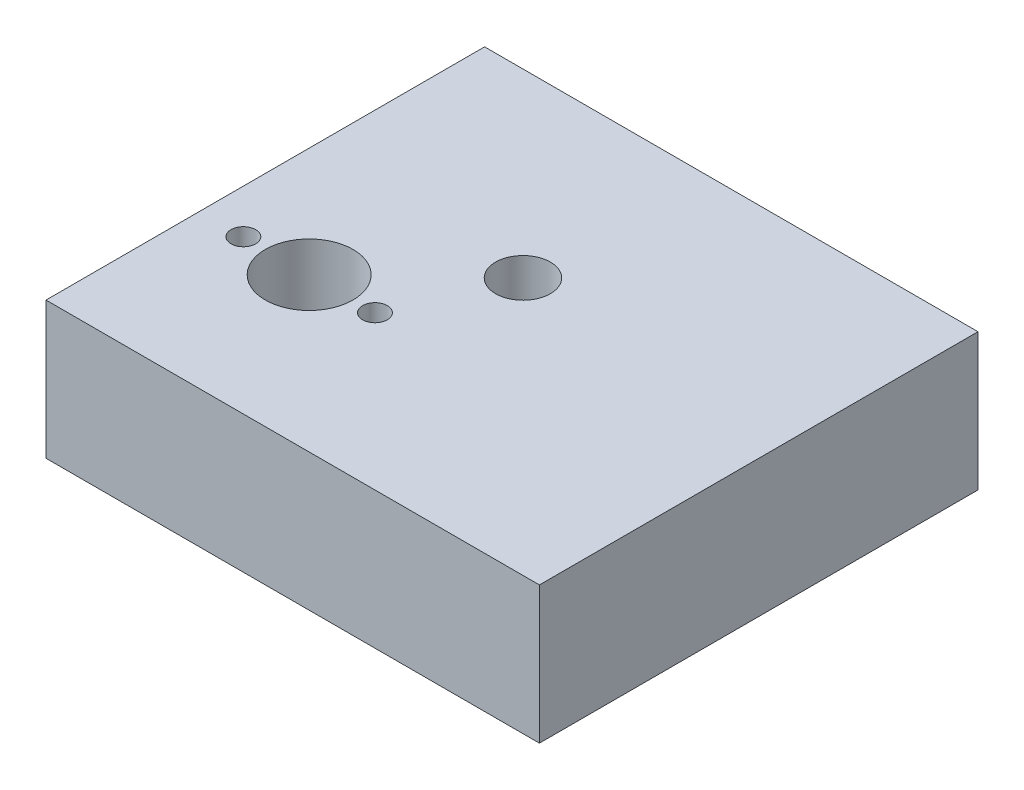
ISO-10303-21;
HEADER;
FILE_DESCRIPTION(('STEP AP214'),'2;1');
FILE_NAME('part.step','',(''),(''),'','','');
FILE_SCHEMA(('AUTOMOTIVE_DESIGN { 1 0 10303 214 1 1 1 1 }'));
ENDSEC;
DATA;
#1=APPLICATION_CONTEXT('core data for automotive mechanical design processes');
#2=APPLICATION_PROTOCOL_DEFINITION('international standard','automotive_design',2000,#1);
#3=PRODUCT_CONTEXT('',#1,'mechanical');
#4=PRODUCT('Part','Part','',(#3));
#5=PRODUCT_RELATED_PRODUCT_CATEGORY('part','',(#4));
#6=PRODUCT_DEFINITION_FORMATION('','',#4);
#7=PRODUCT_DEFINITION_CONTEXT('part definition',#1,'design');
#8=PRODUCT_DEFINITION('design','',#6,#7);
#9=PRODUCT_DEFINITION_SHAPE('','',#8);
#10=(LENGTH_UNIT() NAMED_UNIT(*) SI_UNIT(.MILLI.,.METRE.));
#11=(NAMED_UNIT(*) PLANE_ANGLE_UNIT() SI_UNIT($,.RADIAN.));
#12=(NAMED_UNIT(*) SI_UNIT($,.STERADIAN.) SOLID_ANGLE_UNIT());
#13=UNCERTAINTY_MEASURE_WITH_UNIT(LENGTH_MEASURE(1.E-05),#10,'distance_accuracy_value','');
#14=(GEOMETRIC_REPRESENTATION_CONTEXT(3) GLOBAL_UNCERTAINTY_ASSIGNED_CONTEXT((#13)) GLOBAL_UNIT_ASSIGNED_CONTEXT((#10,
#11,#12)) REPRESENTATION_CONTEXT('',''));
#15=CARTESIAN_POINT('',(0.,0.,0.));
#16=DIRECTION('',(0.,0.,1.));
#17=DIRECTION('',(1.,0.,0.));
#18=AXIS2_PLACEMENT_3D('',#15,#16,#17);
#19=CARTESIAN_POINT('',(-25.1303155006859,98.1412894375857,52.));
#20=DIRECTION('',(0.,-1.,0.));
#21=DIRECTION('',(0.,0.,-1.));
#22=AXIS2_PLACEMENT_3D('',#19,#20,#21);
#23=CYLINDRICAL_SURFACE('',#22,8.);
#24=CARTESIAN_POINT('',(-25.1303155006859,23.1412894375857,52.));
#25=DIRECTION('',(0.,-1.,0.));
#26=DIRECTION('',(0.,0.,-1.));
#27=AXIS2_PLACEMENT_3D('',#24,#25,#26);
#28=CIRCLE('',#27,8.);
#29=CARTESIAN_POINT('',(-25.1303155006859,23.1412894375857,44.));
#30=VERTEX_POINT('',#29);
#31=EDGE_CURVE('E190',#30,#30,#28,.T.);
#32=ORIENTED_EDGE('',*,*,#31,.F.);
#33=EDGE_LOOP('',(#32));
#34=FACE_BOUND('',#33,.T.);
#35=CARTESIAN_POINT('',(-25.1303155006859,8.64128943758573,52.));
#36=DIRECTION('',(0.,-1.,0.));
#37=DIRECTION('',(0.,0.,-1.));
#38=AXIS2_PLACEMENT_3D('',#35,#36,#37);
#39=CIRCLE('',#38,8.);
#40=CARTESIAN_POINT('',(-25.1303155006859,8.64128943758573,44.));
#41=VERTEX_POINT('',#40);
#42=EDGE_CURVE('E11',#41,#41,#39,.T.);
#43=ORIENTED_EDGE('',*,*,#42,.T.);
#44=EDGE_LOOP('',(#43));
#45=FACE_BOUND('',#44,.T.);
#46=ADVANCED_FACE('F38',(#34,#45),#23,.F.);
#47=CARTESIAN_POINT('',(-45.1303155006859,23.1412894375857,80.));
#48=DIRECTION('',(1.,0.,0.));
#49=DIRECTION('',(0.,0.,-1.));
#50=AXIS2_PLACEMENT_3D('',#47,#48,#49);
#51=PLANE('',#50);
#52=DIRECTION('',(0.,-1.,0.));
#53=VECTOR('',#52,1.);
#54=CARTESIAN_POINT('',(-45.1303155006859,23.1412894375857,0.));
#55=LINE('',#54,#53);
#56=CARTESIAN_POINT('',(-45.1303155006859,23.1412894375857,0.));
#57=VERTEX_POINT('',#56);
#58=CARTESIAN_POINT('',(-45.1303155006859,-1.85871056241427,0.));
#59=VERTEX_POINT('',#58);
#60=EDGE_CURVE('E124',#57,#59,#55,.T.);
#61=ORIENTED_EDGE('',*,*,#60,.T.);
#62=DIRECTION('',(0.,0.,-1.));
#63=VECTOR('',#62,1.);
#64=CARTESIAN_POINT('',(-45.1303155006859,-1.85871056241427,80.));
#65=LINE('',#64,#63);
#66=CARTESIAN_POINT('',(-45.1303155006859,-1.85871056241427,80.));
#67=VERTEX_POINT('',#66);
#68=EDGE_CURVE('E47',#67,#59,#65,.T.);
#69=ORIENTED_EDGE('',*,*,#68,.F.);
#70=DIRECTION('',(0.,-1.,0.));
#71=VECTOR('',#70,1.);
#72=CARTESIAN_POINT('',(-45.1303155006859,23.1412894375857,80.));
#73=LINE('',#72,#71);
#74=CARTESIAN_POINT('',(-45.1303155006859,23.1412894375857,80.));
#75=VERTEX_POINT('',#74);
#76=EDGE_CURVE('E130',#75,#67,#73,.T.);
#77=ORIENTED_EDGE('',*,*,#76,.F.);
#78=DIRECTION('',(0.,0.,-1.));
#79=VECTOR('',#78,1.);
#80=CARTESIAN_POINT('',(-45.1303155006859,23.1412894375857,80.));
#81=LINE('',#80,#79);
#82=EDGE_CURVE('E136',#75,#57,#81,.T.);
#83=ORIENTED_EDGE('',*,*,#82,.T.);
#84=EDGE_LOOP('',(#61,#69,#77,#83));
#85=FACE_BOUND('',#84,.T.);
#86=ADVANCED_FACE('F40',(#85),#51,.F.);
#87=CARTESIAN_POINT('',(-45.1303155006859,-1.85871056241427,80.));
#88=DIRECTION('',(0.,1.,0.));
#89=DIRECTION('',(0.,0.,1.));
#90=AXIS2_PLACEMENT_3D('',#87,#88,#89);
#91=PLANE('',#90);
#92=CARTESIAN_POINT('',(-5.13031550068586,-1.85871056241427,33.));
#93=DIRECTION('',(0.,-1.,0.));
#94=DIRECTION('',(0.,0.,-1.));
#95=AXIS2_PLACEMENT_3D('',#92,#93,#94);
#96=CIRCLE('',#95,25.);
#97=CARTESIAN_POINT('',(-28.2547202341348,-1.85871056241427,42.5006265963695));
#98=VERTEX_POINT('',#97);
#99=CARTESIAN_POINT('',(-15.8035454584327,-1.85871056241427,55.6071263602665));
#100=VERTEX_POINT('',#99);
#101=EDGE_CURVE('E117',#98,#100,#96,.T.);
#102=ORIENTED_EDGE('',*,*,#101,.F.);
#103=CARTESIAN_POINT('',(-25.1303155006859,-1.85871056241427,52.));
#104=DIRECTION('',(0.,-1.,0.));
#105=DIRECTION('',(0.,0.,-1.));
#106=AXIS2_PLACEMENT_3D('',#103,#104,#105);
#107=CIRCLE('',#106,10.);
#108=EDGE_CURVE('E104',#100,#98,#107,.T.);
#109=ORIENTED_EDGE('',*,*,#108,.F.);
#110=EDGE_LOOP('',(#102,#109));
#111=FACE_BOUND('',#110,.T.);
#112=DIRECTION('',(1.,0.,0.));
#113=VECTOR('',#112,1.);
#114=CARTESIAN_POINT('',(-45.1303155006859,-1.85871056241427,0.));
#115=LINE('',#114,#113);
#116=CARTESIAN_POINT('',(44.8696844993141,-1.85871056241427,0.));
#117=VERTEX_POINT('',#116);
#118=EDGE_CURVE('E139',#59,#117,#115,.T.);
#119=ORIENTED_EDGE('',*,*,#118,.T.);
#120=DIRECTION('',(0.,0.,-1.));
#121=VECTOR('',#120,1.);
#122=CARTESIAN_POINT('',(44.8696844993141,-1.85871056241427,80.));
#123=LINE('',#122,#121);
#124=CARTESIAN_POINT('',(44.8696844993141,-1.85871056241427,80.));
#125=VERTEX_POINT('',#124);
#126=EDGE_CURVE('E146',#125,#117,#123,.T.);
#127=ORIENTED_EDGE('',*,*,#126,.F.);
#128=DIRECTION('',(1.,0.,0.));
#129=VECTOR('',#128,1.);
#130=CARTESIAN_POINT('',(-45.1303155006859,-1.85871056241427,80.));
#131=LINE('',#130,#129);
#132=EDGE_CURVE('E87',#67,#125,#131,.T.);
#133=ORIENTED_EDGE('',*,*,#132,.F.);
#134=ORIENTED_EDGE('',*,*,#68,.T.);
#135=EDGE_LOOP('',(#119,#127,#133,#134));
#136=FACE_BOUND('',#135,.T.);
#137=ADVANCED_FACE('F116',(#111,#136),#91,.F.);
#138=CARTESIAN_POINT('',(44.8696844993141,23.1412894375857,80.));
#139=DIRECTION('',(-1.,0.,0.));
#140=DIRECTION('',(0.,0.,1.));
#141=AXIS2_PLACEMENT_3D('',#138,#139,#140);
#142=PLANE('',#141);
#143=DIRECTION('',(0.,1.,0.));
#144=VECTOR('',#143,1.);
#145=CARTESIAN_POINT('',(44.8696844993141,23.1412894375857,0.));
#146=LINE('',#145,#144);
#147=CARTESIAN_POINT('',(44.8696844993141,23.1412894375857,0.));
#148=VERTEX_POINT('',#147);
#149=EDGE_CURVE('E73',#117,#148,#146,.T.);
#150=ORIENTED_EDGE('',*,*,#149,.T.);
#151=DIRECTION('',(0.,0.,-1.));
#152=VECTOR('',#151,1.);
#153=CARTESIAN_POINT('',(44.8696844993141,23.1412894375857,80.));
#154=LINE('',#153,#152);
#155=CARTESIAN_POINT('',(44.8696844993141,23.1412894375857,80.));
#156=VERTEX_POINT('',#155);
#157=EDGE_CURVE('E144',#156,#148,#154,.T.);
#158=ORIENTED_EDGE('',*,*,#157,.F.);
#159=DIRECTION('',(0.,1.,0.));
#160=VECTOR('',#159,1.);
#161=CARTESIAN_POINT('',(44.8696844993141,23.1412894375857,80.));
#162=LINE('',#161,#160);
#163=EDGE_CURVE('E133',#125,#156,#162,.T.);
#164=ORIENTED_EDGE('',*,*,#163,.F.);
#165=ORIENTED_EDGE('',*,*,#126,.T.);
#166=EDGE_LOOP('',(#150,#158,#164,#165));
#167=FACE_BOUND('',#166,.T.);
#168=ADVANCED_FACE('F219',(#167),#142,.F.);
#169=CARTESIAN_POINT('',(-45.1303155006859,23.1412894375857,80.));
#170=DIRECTION('',(0.,-1.,0.));
#171=DIRECTION('',(0.,0.,-1.));
#172=AXIS2_PLACEMENT_3D('',#169,#170,#171);
#173=PLANE('',#172);
#174=CARTESIAN_POINT('',(-13.1303155006859,23.1412894375857,52.));
#175=DIRECTION('',(0.,1.,0.));
#176=DIRECTION('',(0.,0.,1.));
#177=AXIS2_PLACEMENT_3D('',#174,#175,#176);
#178=CIRCLE('',#177,2.25);
#179=CARTESIAN_POINT('',(-13.1303155006859,23.1412894375857,54.25));
#180=VERTEX_POINT('',#179);
#181=EDGE_CURVE('E202',#180,#180,#178,.T.);
#182=ORIENTED_EDGE('',*,*,#181,.F.);
#183=EDGE_LOOP('',(#182));
#184=FACE_BOUND('',#183,.T.);
#185=CARTESIAN_POINT('',(-37.1303155006859,23.1412894375857,52.));
#186=DIRECTION('',(0.,1.,0.));
#187=DIRECTION('',(0.,0.,1.));
#188=AXIS2_PLACEMENT_3D('',#185,#186,#187);
#189=CIRCLE('',#188,2.25);
#190=CARTESIAN_POINT('',(-37.1303155006859,23.1412894375857,54.25));
#191=VERTEX_POINT('',#190);
#192=EDGE_CURVE('E196',#191,#191,#189,.T.);
#193=ORIENTED_EDGE('',*,*,#192,.F.);
#194=EDGE_LOOP('',(#193));
#195=FACE_BOUND('',#194,.T.);
#196=ORIENTED_EDGE('',*,*,#31,.T.);
#197=EDGE_LOOP('',(#196));
#198=FACE_BOUND('',#197,.T.);
#199=CARTESIAN_POINT('',(-5.13031550068586,23.1412894375857,33.));
#200=DIRECTION('',(0.,-1.,0.));
#201=DIRECTION('',(0.,0.,-1.));
#202=AXIS2_PLACEMENT_3D('',#199,#200,#201);
#203=CIRCLE('',#202,5.);
#204=CARTESIAN_POINT('',(-5.13031550068586,23.1412894375857,28.));
#205=VERTEX_POINT('',#204);
#206=EDGE_CURVE('E122',#205,#205,#203,.T.);
#207=ORIENTED_EDGE('',*,*,#206,.T.);
#208=EDGE_LOOP('',(#207));
#209=FACE_BOUND('',#208,.T.);
#210=DIRECTION('',(-1.,0.,0.));
#211=VECTOR('',#210,1.);
#212=CARTESIAN_POINT('',(-45.1303155006859,23.1412894375857,0.));
#213=LINE('',#212,#211);
#214=EDGE_CURVE('E79',#148,#57,#213,.T.);
#215=ORIENTED_EDGE('',*,*,#214,.T.);
#216=ORIENTED_EDGE('',*,*,#82,.F.);
#217=DIRECTION('',(-1.,0.,0.));
#218=VECTOR('',#217,1.);
#219=CARTESIAN_POINT('',(-45.1303155006859,23.1412894375857,80.));
#220=LINE('',#219,#218);
#221=EDGE_CURVE('E55',#156,#75,#220,.T.);
#222=ORIENTED_EDGE('',*,*,#221,.F.);
#223=ORIENTED_EDGE('',*,*,#157,.T.);
#224=EDGE_LOOP('',(#215,#216,#222,#223));
#225=FACE_BOUND('',#224,.T.);
#226=ADVANCED_FACE('F163',(#184,#195,#198,#209,#225),#173,.F.);
#227=CARTESIAN_POINT('',(0.,0.,80.));
#228=DIRECTION('',(0.,0.,1.));
#229=DIRECTION('',(1.,0.,0.));
#230=AXIS2_PLACEMENT_3D('',#227,#228,#229);
#231=PLANE('',#230);
#232=ORIENTED_EDGE('',*,*,#76,.T.);
#233=ORIENTED_EDGE('',*,*,#132,.T.);
#234=ORIENTED_EDGE('',*,*,#163,.T.);
#235=ORIENTED_EDGE('',*,*,#221,.T.);
#236=EDGE_LOOP('',(#232,#233,#234,#235));
#237=FACE_BOUND('',#236,.T.);
#238=ADVANCED_FACE('F155',(#237),#231,.T.);
#239=CARTESIAN_POINT('',(0.,0.,0.));
#240=DIRECTION('',(0.,0.,1.));
#241=DIRECTION('',(1.,0.,0.));
#242=AXIS2_PLACEMENT_3D('',#239,#240,#241);
#243=PLANE('',#242);
#244=ORIENTED_EDGE('',*,*,#60,.F.);
#245=ORIENTED_EDGE('',*,*,#214,.F.);
#246=ORIENTED_EDGE('',*,*,#149,.F.);
#247=ORIENTED_EDGE('',*,*,#118,.F.);
#248=EDGE_LOOP('',(#244,#245,#246,#247));
#249=FACE_BOUND('',#248,.T.);
#250=ADVANCED_FACE('F153',(#249),#243,.F.);
#251=CARTESIAN_POINT('',(-5.13031550068586,8.64128943758573,33.));
#252=DIRECTION('',(0.,-1.,0.));
#253=DIRECTION('',(0.,0.,-1.));
#254=AXIS2_PLACEMENT_3D('',#251,#252,#253);
#255=CYLINDRICAL_SURFACE('',#254,25.);
#256=CARTESIAN_POINT('',(-5.13031550068586,8.64128943758573,33.));
#257=DIRECTION('',(0.,-1.,0.));
#258=DIRECTION('',(0.,0.,-1.));
#259=AXIS2_PLACEMENT_3D('',#256,#257,#258);
#260=CIRCLE('',#259,25.);
#261=CARTESIAN_POINT('',(-28.2547202341348,8.64128943758573,42.5006265963695));
#262=VERTEX_POINT('',#261);
#263=CARTESIAN_POINT('',(-15.8035454584327,8.64128943758573,55.6071263602665));
#264=VERTEX_POINT('',#263);
#265=EDGE_CURVE('E121',#262,#264,#260,.T.);
#266=ORIENTED_EDGE('',*,*,#265,.F.);
#267=DIRECTION('',(0.,-1.,0.));
#268=VECTOR('',#267,1.);
#269=CARTESIAN_POINT('',(-28.2547202341348,3.39128943758573,42.5006265963695));
#270=LINE('',#269,#268);
#271=EDGE_CURVE('E112',#262,#98,#270,.T.);
#272=ORIENTED_EDGE('',*,*,#271,.T.);
#273=ORIENTED_EDGE('',*,*,#101,.T.);
#274=DIRECTION('',(0.,-1.,0.));
#275=VECTOR('',#274,1.);
#276=CARTESIAN_POINT('',(-15.8035454584327,3.39128943758573,55.6071263602665));
#277=LINE('',#276,#275);
#278=EDGE_CURVE('E101',#100,#264,#277,.F.);
#279=ORIENTED_EDGE('',*,*,#278,.T.);
#280=EDGE_LOOP('',(#266,#272,#273,#279));
#281=FACE_BOUND('',#280,.T.);
#282=ADVANCED_FACE('F120',(#281),#255,.F.);
#283=CARTESIAN_POINT('',(-5.13031550068586,8.64128943758573,33.));
#284=DIRECTION('',(0.,-1.,0.));
#285=DIRECTION('',(0.,0.,-1.));
#286=AXIS2_PLACEMENT_3D('',#283,#284,#285);
#287=PLANE('',#286);
#288=CARTESIAN_POINT('',(-25.1303155006859,8.64128943758573,52.));
#289=DIRECTION('',(0.,-1.,0.));
#290=DIRECTION('',(0.,0.,-1.));
#291=AXIS2_PLACEMENT_3D('',#288,#289,#290);
#292=CIRCLE('',#291,10.);
#293=EDGE_CURVE('E107',#264,#262,#292,.T.);
#294=ORIENTED_EDGE('',*,*,#293,.T.);
#295=ORIENTED_EDGE('',*,*,#265,.T.);
#296=EDGE_LOOP('',(#294,#295));
#297=FACE_BOUND('',#296,.T.);
#298=ORIENTED_EDGE('',*,*,#42,.F.);
#299=EDGE_LOOP('',(#298));
#300=FACE_BOUND('',#299,.T.);
#301=CARTESIAN_POINT('',(-5.13031550068586,8.64128943758573,33.));
#302=DIRECTION('',(0.,-1.,0.));
#303=DIRECTION('',(0.,0.,-1.));
#304=AXIS2_PLACEMENT_3D('',#301,#302,#303);
#305=CIRCLE('',#304,5.);
#306=CARTESIAN_POINT('',(-5.13031550068586,8.64128943758573,28.));
#307=VERTEX_POINT('',#306);
#308=EDGE_CURVE('E127',#307,#307,#305,.T.);
#309=ORIENTED_EDGE('',*,*,#308,.F.);
#310=EDGE_LOOP('',(#309));
#311=FACE_BOUND('',#310,.T.);
#312=ADVANCED_FACE('F161',(#297,#300,#311),#287,.T.);
#313=CARTESIAN_POINT('',(-5.13031550068586,108.641289437586,33.));
#314=DIRECTION('',(0.,-1.,0.));
#315=DIRECTION('',(0.,0.,-1.));
#316=AXIS2_PLACEMENT_3D('',#313,#314,#315);
#317=CYLINDRICAL_SURFACE('',#316,5.);
#318=ORIENTED_EDGE('',*,*,#308,.T.);
#319=EDGE_LOOP('',(#318));
#320=FACE_BOUND('',#319,.T.);
#321=ORIENTED_EDGE('',*,*,#206,.F.);
#322=EDGE_LOOP('',(#321));
#323=FACE_BOUND('',#322,.T.);
#324=ADVANCED_FACE('F177',(#320,#323),#317,.F.);
#325=CARTESIAN_POINT('',(-25.1303155006859,8.64128943758573,52.));
#326=DIRECTION('',(0.,-1.,0.));
#327=DIRECTION('',(0.,0.,-1.));
#328=AXIS2_PLACEMENT_3D('',#325,#326,#327);
#329=CYLINDRICAL_SURFACE('',#328,10.);
#330=ORIENTED_EDGE('',*,*,#293,.F.);
#331=ORIENTED_EDGE('',*,*,#278,.F.);
#332=ORIENTED_EDGE('',*,*,#108,.T.);
#333=ORIENTED_EDGE('',*,*,#271,.F.);
#334=EDGE_LOOP('',(#330,#331,#332,#333));
#335=FACE_BOUND('',#334,.T.);
#336=ADVANCED_FACE('F103',(#335),#329,.F.);
#337=CARTESIAN_POINT('',(-37.1303155006859,12.6412894375857,52.));
#338=DIRECTION('',(0.,1.,0.));
#339=DIRECTION('',(0.,0.,1.));
#340=AXIS2_PLACEMENT_3D('',#337,#338,#339);
#341=CYLINDRICAL_SURFACE('',#340,2.25);
#342=CARTESIAN_POINT('',(-37.1303155006859,12.6412894375857,52.));
#343=DIRECTION('',(0.,1.,0.));
#344=DIRECTION('',(0.,0.,1.));
#345=AXIS2_PLACEMENT_3D('',#342,#343,#344);
#346=CIRCLE('',#345,2.25);
#347=CARTESIAN_POINT('',(-37.1303155006859,12.6412894375857,54.25));
#348=VERTEX_POINT('',#347);
#349=EDGE_CURVE('E118',#348,#348,#346,.T.);
#350=CARTESIAN_POINT('',(-37.1303155006859,12.6412894375857,54.25));
#351=CARTESIAN_POINT('',(-37.1303155006859,12.7506644375857,54.25));
#352=CARTESIAN_POINT('',(-37.1303155006859,12.8600394375857,54.25));
#353=CARTESIAN_POINT('',(-37.1303155006859,13.0787894375857,54.25));
#354=CARTESIAN_POINT('',(-37.1303155006859,13.1881644375857,54.25));
#355=CARTESIAN_POINT('',(-37.1303155006859,13.4069144375857,54.25));
#356=CARTESIAN_POINT('',(-37.1303155006859,13.5162894375857,54.25));
#357=CARTESIAN_POINT('',(-37.1303155006859,13.7350394375857,54.25));
#358=CARTESIAN_POINT('',(-37.1303155006859,13.8444144375857,54.25));
#359=CARTESIAN_POINT('',(-37.1303155006859,14.0631644375857,54.25));
#360=CARTESIAN_POINT('',(-37.1303155006859,14.1725394375857,54.25));
#361=CARTESIAN_POINT('',(-37.1303155006859,14.3912894375857,54.25));
#362=CARTESIAN_POINT('',(-37.1303155006859,14.5006644375857,54.25));
#363=CARTESIAN_POINT('',(-37.1303155006859,14.7194144375857,54.25));
#364=CARTESIAN_POINT('',(-37.1303155006859,14.8287894375857,54.25));
#365=CARTESIAN_POINT('',(-37.1303155006859,15.0475394375857,54.25));
#366=CARTESIAN_POINT('',(-37.1303155006859,15.1569144375857,54.25));
#367=CARTESIAN_POINT('',(-37.1303155006859,15.3756644375857,54.25));
#368=CARTESIAN_POINT('',(-37.1303155006859,15.4850394375857,54.25));
#369=CARTESIAN_POINT('',(-37.1303155006859,15.7037894375857,54.25));
#370=CARTESIAN_POINT('',(-37.1303155006859,15.8131644375857,54.25));
#371=CARTESIAN_POINT('',(-37.1303155006859,16.0319144375857,54.25));
#372=CARTESIAN_POINT('',(-37.1303155006859,16.1412894375857,54.25));
#373=CARTESIAN_POINT('',(-37.1303155006859,16.3600394375857,54.25));
#374=CARTESIAN_POINT('',(-37.1303155006859,16.4694144375857,54.25));
#375=CARTESIAN_POINT('',(-37.1303155006859,16.6881644375857,54.25));
#376=CARTESIAN_POINT('',(-37.1303155006859,16.7975394375857,54.25));
#377=CARTESIAN_POINT('',(-37.1303155006859,17.0162894375857,54.25));
#378=CARTESIAN_POINT('',(-37.1303155006859,17.1256644375857,54.25));
#379=CARTESIAN_POINT('',(-37.1303155006859,17.3444144375857,54.25));
#380=CARTESIAN_POINT('',(-37.1303155006859,17.4537894375857,54.25));
#381=CARTESIAN_POINT('',(-37.1303155006859,17.6725394375857,54.25));
#382=CARTESIAN_POINT('',(-37.1303155006859,17.7819144375857,54.25));
#383=CARTESIAN_POINT('',(-37.1303155006859,18.0006644375857,54.25));
#384=CARTESIAN_POINT('',(-37.1303155006859,18.1100394375857,54.25));
#385=CARTESIAN_POINT('',(-37.1303155006859,18.3287894375857,54.25));
#386=CARTESIAN_POINT('',(-37.1303155006859,18.4381644375857,54.25));
#387=CARTESIAN_POINT('',(-37.1303155006859,18.6569144375857,54.25));
#388=CARTESIAN_POINT('',(-37.1303155006859,18.7662894375857,54.25));
#389=CARTESIAN_POINT('',(-37.1303155006859,18.9850394375857,54.25));
#390=CARTESIAN_POINT('',(-37.1303155006859,19.0944144375857,54.25));
#391=CARTESIAN_POINT('',(-37.1303155006859,19.3131644375857,54.25));
#392=CARTESIAN_POINT('',(-37.1303155006859,19.4225394375857,54.25));
#393=CARTESIAN_POINT('',(-37.1303155006859,19.6412894375857,54.25));
#394=CARTESIAN_POINT('',(-37.1303155006859,19.7506644375857,54.25));
#395=CARTESIAN_POINT('',(-37.1303155006859,19.9694144375857,54.25));
#396=CARTESIAN_POINT('',(-37.1303155006859,20.0787894375857,54.25));
#397=CARTESIAN_POINT('',(-37.1303155006859,20.2975394375857,54.25));
#398=CARTESIAN_POINT('',(-37.1303155006859,20.4069144375857,54.25));
#399=CARTESIAN_POINT('',(-37.1303155006859,20.6256644375857,54.25));
#400=CARTESIAN_POINT('',(-37.1303155006859,20.7350394375857,54.25));
#401=CARTESIAN_POINT('',(-37.1303155006859,20.9537894375857,54.25));
#402=CARTESIAN_POINT('',(-37.1303155006859,21.0631644375857,54.25));
#403=CARTESIAN_POINT('',(-37.1303155006859,21.2819144375857,54.25));
#404=CARTESIAN_POINT('',(-37.1303155006859,21.3912894375857,54.25));
#405=CARTESIAN_POINT('',(-37.1303155006859,21.6100394375857,54.25));
#406=CARTESIAN_POINT('',(-37.1303155006859,21.7194144375857,54.25));
#407=CARTESIAN_POINT('',(-37.1303155006859,21.9381644375857,54.25));
#408=CARTESIAN_POINT('',(-37.1303155006859,22.0475394375857,54.25));
#409=CARTESIAN_POINT('',(-37.1303155006859,22.2662894375857,54.25));
#410=CARTESIAN_POINT('',(-37.1303155006859,22.3756644375857,54.25));
#411=CARTESIAN_POINT('',(-37.1303155006859,22.5944144375857,54.25));
#412=CARTESIAN_POINT('',(-37.1303155006859,22.7037894375857,54.25));
#413=CARTESIAN_POINT('',(-37.1303155006859,22.9225394375857,54.25));
#414=CARTESIAN_POINT('',(-37.1303155006859,23.0319144375857,54.25));
#415=CARTESIAN_POINT('',(-37.1303155006859,23.1412894375857,54.25));
#416=B_SPLINE_CURVE_WITH_KNOTS('',3,(#350,#351,#352,#353,#354,#355,#356,#357,#358,#359,#360,
#361,#362,#363,#364,#365,#366,#367,#368,#369,#370,#371,#372,#373,#374,#375,#376,#377,#378,#379,
#380,#381,#382,#383,#384,#385,#386,#387,#388,#389,#390,#391,#392,#393,#394,#395,#396,#397,#398,
#399,#400,#401,#402,#403,#404,#405,#406,#407,#408,#409,#410,#411,#412,#413,#414,#415),
.UNSPECIFIED.,.F.,.F.,(4,2,2,2,2,2,2,2,2,2,2,2,2,2,2,2,2,2,2,2,2,2,2,2,2,2,2,2,2,2,2,2,4),(0.,
0.328125,0.656250000000001,0.984375000000001,1.3125,1.640625,1.96875,2.296875,2.625,2.953125,
3.28125,3.609375,3.9375,4.265625,4.59375,4.921875,5.25,5.578125,5.90625,6.234375,6.5625,
6.890625,7.21875,7.54687500000001,7.875,8.203125,8.53125,8.859375,9.1875,9.515625,9.84375,
10.171875,10.5),.UNSPECIFIED.);
#417=EDGE_CURVE('BSEAM226',#348,#191,#416,.T.);
#418=ORIENTED_EDGE('',*,*,#349,.F.);
#419=ORIENTED_EDGE('',*,*,#192,.T.);
#420=ORIENTED_EDGE('',*,*,#417,.T.);
#421=ORIENTED_EDGE('',*,*,#417,.F.);
#422=EDGE_LOOP('',(#418,#420,#419,#421));
#423=FACE_BOUND('',#422,.T.);
#424=ADVANCED_FACE('F226',(#423),#341,.F.);
#425=CARTESIAN_POINT('',(-37.1303155006859,12.6412894375857,52.));
#426=DIRECTION('',(0.,1.,0.));
#427=DIRECTION('',(0.,0.,1.));
#428=AXIS2_PLACEMENT_3D('',#425,#426,#427);
#429=PLANE('',#428);
#430=ORIENTED_EDGE('',*,*,#349,.T.);
#431=EDGE_LOOP('',(#430));
#432=FACE_BOUND('',#431,.T.);
#433=ADVANCED_FACE('F213',(#432),#429,.T.);
#434=CARTESIAN_POINT('',(-13.1303155006859,12.6412894375857,52.));
#435=DIRECTION('',(0.,1.,0.));
#436=DIRECTION('',(0.,0.,1.));
#437=AXIS2_PLACEMENT_3D('',#434,#435,#436);
#438=CYLINDRICAL_SURFACE('',#437,2.25);
#439=CARTESIAN_POINT('',(-13.1303155006859,12.6412894375857,52.));
#440=DIRECTION('',(0.,1.,0.));
#441=DIRECTION('',(0.,0.,1.));
#442=AXIS2_PLACEMENT_3D('',#439,#440,#441);
#443=CIRCLE('',#442,2.25);
#444=CARTESIAN_POINT('',(-13.1303155006859,12.6412894375857,54.25));
#445=VERTEX_POINT('',#444);
#446=EDGE_CURVE('E199',#445,#445,#443,.T.);
#447=CARTESIAN_POINT('',(-13.1303155006859,12.6412894375857,54.25));
#448=CARTESIAN_POINT('',(-13.1303155006859,12.7506644375857,54.25));
#449=CARTESIAN_POINT('',(-13.1303155006859,12.8600394375857,54.25));
#450=CARTESIAN_POINT('',(-13.1303155006859,13.0787894375857,54.25));
#451=CARTESIAN_POINT('',(-13.1303155006859,13.1881644375857,54.25));
#452=CARTESIAN_POINT('',(-13.1303155006859,13.4069144375857,54.25));
#453=CARTESIAN_POINT('',(-13.1303155006859,13.5162894375857,54.25));
#454=CARTESIAN_POINT('',(-13.1303155006859,13.7350394375857,54.25));
#455=CARTESIAN_POINT('',(-13.1303155006859,13.8444144375857,54.25));
#456=CARTESIAN_POINT('',(-13.1303155006859,14.0631644375857,54.25));
#457=CARTESIAN_POINT('',(-13.1303155006859,14.1725394375857,54.25));
#458=CARTESIAN_POINT('',(-13.1303155006859,14.3912894375857,54.25));
#459=CARTESIAN_POINT('',(-13.1303155006859,14.5006644375857,54.25));
#460=CARTESIAN_POINT('',(-13.1303155006859,14.7194144375857,54.25));
#461=CARTESIAN_POINT('',(-13.1303155006859,14.8287894375857,54.25));
#462=CARTESIAN_POINT('',(-13.1303155006859,15.0475394375857,54.25));
#463=CARTESIAN_POINT('',(-13.1303155006859,15.1569144375857,54.25));
#464=CARTESIAN_POINT('',(-13.1303155006859,15.3756644375857,54.25));
#465=CARTESIAN_POINT('',(-13.1303155006859,15.4850394375857,54.25));
#466=CARTESIAN_POINT('',(-13.1303155006859,15.7037894375857,54.25));
#467=CARTESIAN_POINT('',(-13.1303155006859,15.8131644375857,54.25));
#468=CARTESIAN_POINT('',(-13.1303155006859,16.0319144375857,54.25));
#469=CARTESIAN_POINT('',(-13.1303155006859,16.1412894375857,54.25));
#470=CARTESIAN_POINT('',(-13.1303155006859,16.3600394375857,54.25));
#471=CARTESIAN_POINT('',(-13.1303155006859,16.4694144375857,54.25));
#472=CARTESIAN_POINT('',(-13.1303155006859,16.6881644375857,54.25));
#473=CARTESIAN_POINT('',(-13.1303155006859,16.7975394375857,54.25));
#474=CARTESIAN_POINT('',(-13.1303155006859,17.0162894375857,54.25));
#475=CARTESIAN_POINT('',(-13.1303155006859,17.1256644375857,54.25));
#476=CARTESIAN_POINT('',(-13.1303155006859,17.3444144375857,54.25));
#477=CARTESIAN_POINT('',(-13.1303155006859,17.4537894375857,54.25));
#478=CARTESIAN_POINT('',(-13.1303155006859,17.6725394375857,54.25));
#479=CARTESIAN_POINT('',(-13.1303155006859,17.7819144375857,54.25));
#480=CARTESIAN_POINT('',(-13.1303155006859,18.0006644375857,54.25));
#481=CARTESIAN_POINT('',(-13.1303155006859,18.1100394375857,54.25));
#482=CARTESIAN_POINT('',(-13.1303155006859,18.3287894375857,54.25));
#483=CARTESIAN_POINT('',(-13.1303155006859,18.4381644375857,54.25));
#484=CARTESIAN_POINT('',(-13.1303155006859,18.6569144375857,54.25));
#485=CARTESIAN_POINT('',(-13.1303155006859,18.7662894375857,54.25));
#486=CARTESIAN_POINT('',(-13.1303155006859,18.9850394375857,54.25));
#487=CARTESIAN_POINT('',(-13.1303155006859,19.0944144375857,54.25));
#488=CARTESIAN_POINT('',(-13.1303155006859,19.3131644375857,54.25));
#489=CARTESIAN_POINT('',(-13.1303155006859,19.4225394375857,54.25));
#490=CARTESIAN_POINT('',(-13.1303155006859,19.6412894375857,54.25));
#491=CARTESIAN_POINT('',(-13.1303155006859,19.7506644375857,54.25));
#492=CARTESIAN_POINT('',(-13.1303155006859,19.9694144375857,54.25));
#493=CARTESIAN_POINT('',(-13.1303155006859,20.0787894375857,54.25));
#494=CARTESIAN_POINT('',(-13.1303155006859,20.2975394375857,54.25));
#495=CARTESIAN_POINT('',(-13.1303155006859,20.4069144375857,54.25));
#496=CARTESIAN_POINT('',(-13.1303155006859,20.6256644375857,54.25));
#497=CARTESIAN_POINT('',(-13.1303155006859,20.7350394375857,54.25));
#498=CARTESIAN_POINT('',(-13.1303155006859,20.9537894375857,54.25));
#499=CARTESIAN_POINT('',(-13.1303155006859,21.0631644375857,54.25));
#500=CARTESIAN_POINT('',(-13.1303155006859,21.2819144375857,54.25));
#501=CARTESIAN_POINT('',(-13.1303155006859,21.3912894375857,54.25));
#502=CARTESIAN_POINT('',(-13.1303155006859,21.6100394375857,54.25));
#503=CARTESIAN_POINT('',(-13.1303155006859,21.7194144375857,54.25));
#504=CARTESIAN_POINT('',(-13.1303155006859,21.9381644375857,54.25));
#505=CARTESIAN_POINT('',(-13.1303155006859,22.0475394375857,54.25));
#506=CARTESIAN_POINT('',(-13.1303155006859,22.2662894375857,54.25));
#507=CARTESIAN_POINT('',(-13.1303155006859,22.3756644375857,54.25));
#508=CARTESIAN_POINT('',(-13.1303155006859,22.5944144375857,54.25));
#509=CARTESIAN_POINT('',(-13.1303155006859,22.7037894375857,54.25));
#510=CARTESIAN_POINT('',(-13.1303155006859,22.9225394375857,54.25));
#511=CARTESIAN_POINT('',(-13.1303155006859,23.0319144375857,54.25));
#512=CARTESIAN_POINT('',(-13.1303155006859,23.1412894375857,54.25));
#513=B_SPLINE_CURVE_WITH_KNOTS('',3,(#447,#448,#449,#450,#451,#452,#453,#454,#455,#456,#457,
#458,#459,#460,#461,#462,#463,#464,#465,#466,#467,#468,#469,#470,#471,#472,#473,#474,#475,#476,
#477,#478,#479,#480,#481,#482,#483,#484,#485,#486,#487,#488,#489,#490,#491,#492,#493,#494,#495,
#496,#497,#498,#499,#500,#501,#502,#503,#504,#505,#506,#507,#508,#509,#510,#511,#512),
.UNSPECIFIED.,.F.,.F.,(4,2,2,2,2,2,2,2,2,2,2,2,2,2,2,2,2,2,2,2,2,2,2,2,2,2,2,2,2,2,2,2,4),(0.,
0.328125,0.656250000000001,0.984375000000001,1.3125,1.640625,1.96875,2.296875,2.625,2.953125,
3.28125,3.609375,3.9375,4.265625,4.59375,4.921875,5.25,5.578125,5.90625,6.234375,6.5625,
6.890625,7.21875,7.54687500000001,7.875,8.203125,8.53125,8.859375,9.1875,9.515625,9.84375,
10.171875,10.5),.UNSPECIFIED.);
#514=EDGE_CURVE('BSEAM210',#445,#180,#513,.T.);
#515=ORIENTED_EDGE('',*,*,#446,.F.);
#516=ORIENTED_EDGE('',*,*,#181,.T.);
#517=ORIENTED_EDGE('',*,*,#514,.T.);
#518=ORIENTED_EDGE('',*,*,#514,.F.);
#519=EDGE_LOOP('',(#515,#517,#516,#518));
#520=FACE_BOUND('',#519,.T.);
#521=ADVANCED_FACE('F210',(#520),#438,.F.);
#522=CARTESIAN_POINT('',(-13.1303155006859,12.6412894375857,52.));
#523=DIRECTION('',(0.,1.,0.));
#524=DIRECTION('',(0.,0.,1.));
#525=AXIS2_PLACEMENT_3D('',#522,#523,#524);
#526=PLANE('',#525);
#527=ORIENTED_EDGE('',*,*,#446,.T.);
#528=EDGE_LOOP('',(#527));
#529=FACE_BOUND('',#528,.T.);
#530=ADVANCED_FACE('F208',(#529),#526,.T.);
#531=CLOSED_SHELL('',(#46,#86,#137,#168,#226,#238,#250,#282,#312,#324,#336,#424,#433,#521,#530));
#532=MANIFOLD_SOLID_BREP('B2',#531);
#533=ADVANCED_BREP_SHAPE_REPRESENTATION('',(#18,#532),#14);
#534=SHAPE_DEFINITION_REPRESENTATION(#9,#533);
ENDSEC;
END-ISO-10303-21;
